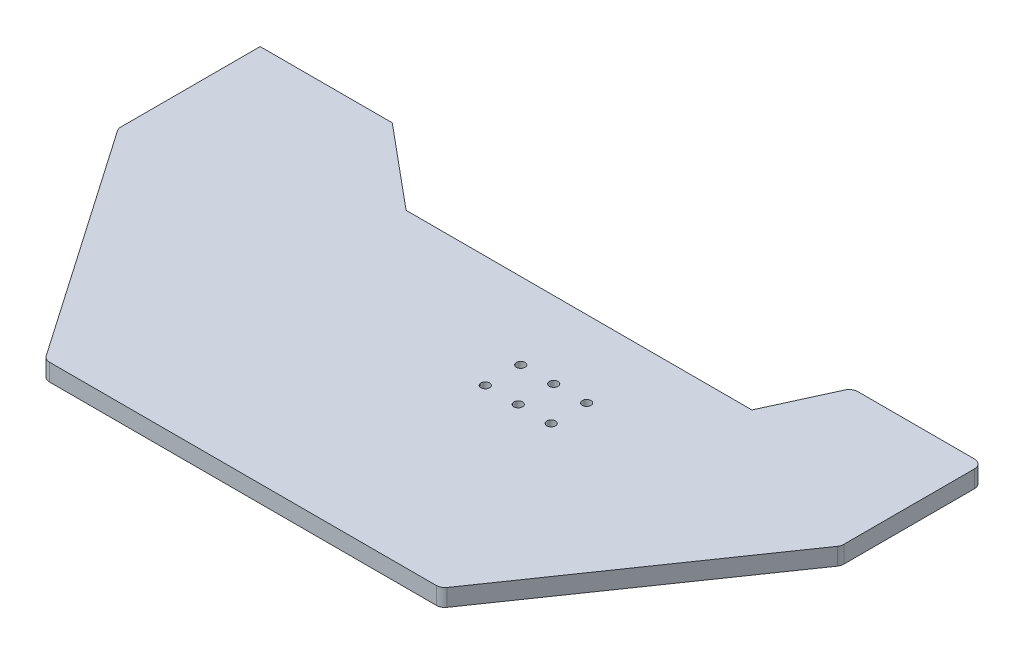
ISO-10303-21;
HEADER;
FILE_DESCRIPTION(('STEP AP214'),'2;1');
FILE_NAME('part.step','',(''),(''),'','','');
FILE_SCHEMA(('AUTOMOTIVE_DESIGN { 1 0 10303 214 1 1 1 1 }'));
ENDSEC;
DATA;
#1=APPLICATION_CONTEXT('core data for automotive mechanical design processes');
#2=APPLICATION_PROTOCOL_DEFINITION('international standard','automotive_design',2000,#1);
#3=PRODUCT_CONTEXT('',#1,'mechanical');
#4=PRODUCT('Part','Part','',(#3));
#5=PRODUCT_RELATED_PRODUCT_CATEGORY('part','',(#4));
#6=PRODUCT_DEFINITION_FORMATION('','',#4);
#7=PRODUCT_DEFINITION_CONTEXT('part definition',#1,'design');
#8=PRODUCT_DEFINITION('design','',#6,#7);
#9=PRODUCT_DEFINITION_SHAPE('','',#8);
#10=(LENGTH_UNIT() NAMED_UNIT(*) SI_UNIT(.MILLI.,.METRE.));
#11=(NAMED_UNIT(*) PLANE_ANGLE_UNIT() SI_UNIT($,.RADIAN.));
#12=(NAMED_UNIT(*) SI_UNIT($,.STERADIAN.) SOLID_ANGLE_UNIT());
#13=UNCERTAINTY_MEASURE_WITH_UNIT(LENGTH_MEASURE(1.E-05),#10,'distance_accuracy_value','');
#14=(GEOMETRIC_REPRESENTATION_CONTEXT(3) GLOBAL_UNCERTAINTY_ASSIGNED_CONTEXT((#13)) GLOBAL_UNIT_ASSIGNED_CONTEXT((#10,
#11,#12)) REPRESENTATION_CONTEXT('',''));
#15=CARTESIAN_POINT('',(0.,0.,0.));
#16=DIRECTION('',(0.,0.,1.));
#17=DIRECTION('',(1.,0.,0.));
#18=AXIS2_PLACEMENT_3D('',#15,#16,#17);
#19=CARTESIAN_POINT('',(-266.7,6.35,139.7));
#20=DIRECTION('',(0.,0.,-1.));
#21=DIRECTION('',(-1.,0.,0.));
#22=AXIS2_PLACEMENT_3D('',#19,#20,#21);
#23=PLANE('',#22);
#24=DIRECTION('',(1.,0.,0.));
#25=VECTOR('',#24,1.);
#26=CARTESIAN_POINT('',(-266.7,-6.35,139.7));
#27=LINE('',#26,#25);
#28=CARTESIAN_POINT('',(-142.719069440013,-6.35,139.7));
#29=VERTEX_POINT('',#28);
#30=CARTESIAN_POINT('',(142.719069440013,-6.35,139.7));
#31=VERTEX_POINT('',#30);
#32=EDGE_CURVE('E184',#29,#31,#27,.T.);
#33=ORIENTED_EDGE('',*,*,#32,.T.);
#34=DIRECTION('',(0.,1.,0.));
#35=VECTOR('',#34,1.);
#36=CARTESIAN_POINT('',(142.719069440013,6.35,139.7));
#37=LINE('',#36,#35);
#38=CARTESIAN_POINT('',(142.719069440013,6.35,139.7));
#39=VERTEX_POINT('',#38);
#40=EDGE_CURVE('E246',#31,#39,#37,.T.);
#41=ORIENTED_EDGE('',*,*,#40,.T.);
#42=DIRECTION('',(1.,0.,0.));
#43=VECTOR('',#42,1.);
#44=CARTESIAN_POINT('',(-266.7,6.35,139.7));
#45=LINE('',#44,#43);
#46=CARTESIAN_POINT('',(-142.719069440013,6.35,139.7));
#47=VERTEX_POINT('',#46);
#48=EDGE_CURVE('E306',#47,#39,#45,.T.);
#49=ORIENTED_EDGE('',*,*,#48,.F.);
#50=DIRECTION('',(0.,1.,0.));
#51=VECTOR('',#50,1.);
#52=CARTESIAN_POINT('',(-142.719069440013,6.35,139.7));
#53=LINE('',#52,#51);
#54=EDGE_CURVE('E244',#47,#29,#53,.F.);
#55=ORIENTED_EDGE('',*,*,#54,.T.);
#56=EDGE_LOOP('',(#33,#41,#49,#55));
#57=FACE_BOUND('',#56,.T.);
#58=ADVANCED_FACE('F33',(#57),#23,.F.);
#59=CARTESIAN_POINT('',(266.7,6.35,-139.7));
#60=DIRECTION('',(-1.,0.,0.));
#61=DIRECTION('',(0.,0.,1.));
#62=AXIS2_PLACEMENT_3D('',#59,#60,#61);
#63=PLANE('',#62);
#64=DIRECTION('',(0.,0.,-1.));
#65=VECTOR('',#64,1.);
#66=CARTESIAN_POINT('',(266.7,-6.35,-139.7));
#67=LINE('',#66,#65);
#68=CARTESIAN_POINT('',(266.7,-6.35,-36.9052942315606));
#69=VERTEX_POINT('',#68);
#70=CARTESIAN_POINT('',(266.7,-6.35,-133.35));
#71=VERTEX_POINT('',#70);
#72=EDGE_CURVE('E188',#69,#71,#67,.T.);
#73=ORIENTED_EDGE('',*,*,#72,.T.);
#74=DIRECTION('',(0.,-1.,0.));
#75=VECTOR('',#74,1.);
#76=CARTESIAN_POINT('',(266.7,6.35,-133.35));
#77=LINE('',#76,#75);
#78=CARTESIAN_POINT('',(266.7,6.35,-133.35));
#79=VERTEX_POINT('',#78);
#80=EDGE_CURVE('E237',#71,#79,#77,.F.);
#81=ORIENTED_EDGE('',*,*,#80,.T.);
#82=DIRECTION('',(0.,0.,-1.));
#83=VECTOR('',#82,1.);
#84=CARTESIAN_POINT('',(266.7,6.35,-139.7));
#85=LINE('',#84,#83);
#86=CARTESIAN_POINT('',(266.7,6.35,-36.9052942315606));
#87=VERTEX_POINT('',#86);
#88=EDGE_CURVE('E308',#87,#79,#85,.T.);
#89=ORIENTED_EDGE('',*,*,#88,.F.);
#90=DIRECTION('',(0.,1.,0.));
#91=VECTOR('',#90,1.);
#92=CARTESIAN_POINT('',(266.7,-6.35,-36.9052942315605));
#93=LINE('',#92,#91);
#94=EDGE_CURVE('E235',#87,#69,#93,.F.);
#95=ORIENTED_EDGE('',*,*,#94,.T.);
#96=EDGE_LOOP('',(#73,#81,#89,#95));
#97=FACE_BOUND('',#96,.T.);
#98=ADVANCED_FACE('F355',(#97),#63,.F.);
#99=CARTESIAN_POINT('',(0.,6.35,0.));
#100=DIRECTION('',(0.,-1.,0.));
#101=DIRECTION('',(0.,0.,-1.));
#102=AXIS2_PLACEMENT_3D('',#99,#100,#101);
#103=PLANE('',#102);
#104=CARTESIAN_POINT('',(81.4832,6.35,-6.24839999999997));
#105=DIRECTION('',(0.,1.,0.));
#106=DIRECTION('',(0.,0.,1.));
#107=AXIS2_PLACEMENT_3D('',#104,#105,#106);
#108=CIRCLE('',#107,3.175);
#109=CARTESIAN_POINT('',(81.4832,6.35,-3.07339999999998));
#110=VERTEX_POINT('',#109);
#111=EDGE_CURVE('E292',#110,#110,#108,.T.);
#112=ORIENTED_EDGE('',*,*,#111,.F.);
#113=EDGE_LOOP('',(#112));
#114=FACE_BOUND('',#113,.T.);
#115=CARTESIAN_POINT('',(81.4832,6.35,-32.4104));
#116=DIRECTION('',(0.,1.,0.));
#117=DIRECTION('',(0.,0.,1.));
#118=AXIS2_PLACEMENT_3D('',#115,#116,#117);
#119=CIRCLE('',#118,3.175);
#120=CARTESIAN_POINT('',(81.4832,6.35,-29.2354));
#121=VERTEX_POINT('',#120);
#122=EDGE_CURVE('E293',#121,#121,#119,.T.);
#123=ORIENTED_EDGE('',*,*,#122,.F.);
#124=EDGE_LOOP('',(#123));
#125=FACE_BOUND('',#124,.T.);
#126=CARTESIAN_POINT('',(57.1627,6.35,-32.4104));
#127=DIRECTION('',(0.,1.,0.));
#128=DIRECTION('',(0.,0.,1.));
#129=AXIS2_PLACEMENT_3D('',#126,#127,#128);
#130=CIRCLE('',#129,3.175);
#131=CARTESIAN_POINT('',(57.1627,6.35,-29.2354));
#132=VERTEX_POINT('',#131);
#133=EDGE_CURVE('E274',#132,#132,#130,.T.);
#134=ORIENTED_EDGE('',*,*,#133,.F.);
#135=EDGE_LOOP('',(#134));
#136=FACE_BOUND('',#135,.T.);
#137=CARTESIAN_POINT('',(32.8422,6.35,-32.4104));
#138=DIRECTION('',(0.,1.,0.));
#139=DIRECTION('',(0.,0.,1.));
#140=AXIS2_PLACEMENT_3D('',#137,#138,#139);
#141=CIRCLE('',#140,3.175);
#142=CARTESIAN_POINT('',(32.8422,6.35,-29.2354));
#143=VERTEX_POINT('',#142);
#144=EDGE_CURVE('E275',#143,#143,#141,.T.);
#145=ORIENTED_EDGE('',*,*,#144,.F.);
#146=EDGE_LOOP('',(#145));
#147=FACE_BOUND('',#146,.T.);
#148=CARTESIAN_POINT('',(32.8422,6.35,-6.24839999999997));
#149=DIRECTION('',(0.,1.,0.));
#150=DIRECTION('',(0.,0.,1.));
#151=AXIS2_PLACEMENT_3D('',#148,#149,#150);
#152=CIRCLE('',#151,3.175);
#153=CARTESIAN_POINT('',(32.8422,6.35,-3.07339999999998));
#154=VERTEX_POINT('',#153);
#155=EDGE_CURVE('E281',#154,#154,#152,.T.);
#156=ORIENTED_EDGE('',*,*,#155,.F.);
#157=EDGE_LOOP('',(#156));
#158=FACE_BOUND('',#157,.T.);
#159=CARTESIAN_POINT('',(57.1627,6.35,-6.24839999999998));
#160=DIRECTION('',(0.,1.,0.));
#161=DIRECTION('',(0.,0.,1.));
#162=AXIS2_PLACEMENT_3D('',#159,#160,#161);
#163=CIRCLE('',#162,3.175);
#164=CARTESIAN_POINT('',(57.1627,6.35,-3.07339999999998));
#165=VERTEX_POINT('',#164);
#166=EDGE_CURVE('E264',#165,#165,#163,.T.);
#167=ORIENTED_EDGE('',*,*,#166,.F.);
#168=EDGE_LOOP('',(#167));
#169=FACE_BOUND('',#168,.T.);
#170=DIRECTION('',(-1.,0.,0.));
#171=VECTOR('',#170,1.);
#172=CARTESIAN_POINT('',(170.18,6.35,-139.7));
#173=LINE('',#172,#171);
#174=CARTESIAN_POINT('',(260.35,6.35,-139.7));
#175=VERTEX_POINT('',#174);
#176=CARTESIAN_POINT('',(174.257872298125,6.35,-139.7));
#177=VERTEX_POINT('',#176);
#178=EDGE_CURVE('E158',#175,#177,#173,.T.);
#179=ORIENTED_EDGE('',*,*,#178,.T.);
#180=CARTESIAN_POINT('',(174.257872298125,6.35,-133.35));
#181=DIRECTION('',(0.,-1.,0.));
#182=DIRECTION('',(0.,0.,-1.));
#183=AXIS2_PLACEMENT_3D('',#180,#181,#182);
#184=CIRCLE('',#183,6.35);
#185=CARTESIAN_POINT('',(168.483489425197,6.35,-135.991780164365));
#186=VERTEX_POINT('',#185);
#187=EDGE_CURVE('E154',#177,#186,#184,.F.);
#188=ORIENTED_EDGE('',*,*,#187,.T.);
#189=DIRECTION('',(-0.416028372340905,0.,0.909351633532033));
#190=VECTOR('',#189,1.);
#191=CARTESIAN_POINT('',(146.939,6.35,-88.9));
#192=LINE('',#191,#190);
#193=CARTESIAN_POINT('',(146.939,6.35,-88.9));
#194=VERTEX_POINT('',#193);
#195=EDGE_CURVE('E146',#186,#194,#192,.T.);
#196=ORIENTED_EDGE('',*,*,#195,.T.);
#197=DIRECTION('',(-1.,0.,0.));
#198=VECTOR('',#197,1.);
#199=CARTESIAN_POINT('',(-108.237741638452,6.35,-88.9));
#200=LINE('',#199,#198);
#201=CARTESIAN_POINT('',(-108.237741638452,6.35,-88.9));
#202=VERTEX_POINT('',#201);
#203=EDGE_CURVE('E151',#194,#202,#200,.T.);
#204=ORIENTED_EDGE('',*,*,#203,.T.);
#205=DIRECTION('',(-0.768374908491942,0.,-0.64));
#206=VECTOR('',#205,1.);
#207=CARTESIAN_POINT('',(-169.2275,6.35,-139.7));
#208=LINE('',#207,#206);
#209=CARTESIAN_POINT('',(-169.2275,6.35,-139.7));
#210=VERTEX_POINT('',#209);
#211=EDGE_CURVE('E173',#202,#210,#208,.T.);
#212=ORIENTED_EDGE('',*,*,#211,.T.);
#213=DIRECTION('',(-1.,0.,0.));
#214=VECTOR('',#213,1.);
#215=CARTESIAN_POINT('',(-266.7,6.35,-139.7));
#216=LINE('',#215,#214);
#217=CARTESIAN_POINT('',(-266.7,6.35,-139.7));
#218=VERTEX_POINT('',#217);
#219=EDGE_CURVE('E175',#210,#218,#216,.T.);
#220=ORIENTED_EDGE('',*,*,#219,.T.);
#221=DIRECTION('',(0.,0.,1.));
#222=VECTOR('',#221,1.);
#223=CARTESIAN_POINT('',(-266.7,6.35,139.7));
#224=LINE('',#223,#222);
#225=CARTESIAN_POINT('',(-266.7,6.35,-36.9052942315606));
#226=VERTEX_POINT('',#225);
#227=EDGE_CURVE('E201',#218,#226,#224,.T.);
#228=ORIENTED_EDGE('',*,*,#227,.T.);
#229=CARTESIAN_POINT('',(-260.35,6.35,-36.9052942315606));
#230=DIRECTION('',(0.,-1.,0.));
#231=DIRECTION('',(0.,0.,-1.));
#232=AXIS2_PLACEMENT_3D('',#229,#230,#231);
#233=CIRCLE('',#232,6.35);
#234=CARTESIAN_POINT('',(-265.574337646892,6.35,-33.2957518573441));
#235=VERTEX_POINT('',#234);
#236=EDGE_CURVE('E226',#226,#235,#233,.F.);
#237=ORIENTED_EDGE('',*,*,#236,.T.);
#238=DIRECTION('',(-0.568431869955349,0.,-0.822730338093269));
#239=VECTOR('',#238,1.);
#240=CARTESIAN_POINT('',(-266.7,6.35,-34.925));
#241=LINE('',#240,#239);
#242=CARTESIAN_POINT('',(-147.943407086905,6.35,136.959542374217));
#243=VERTEX_POINT('',#242);
#244=EDGE_CURVE('E255',#243,#235,#241,.T.);
#245=ORIENTED_EDGE('',*,*,#244,.F.);
#246=CARTESIAN_POINT('',(-142.719069440013,6.35,133.35));
#247=DIRECTION('',(0.,-1.,0.));
#248=DIRECTION('',(0.,0.,-1.));
#249=AXIS2_PLACEMENT_3D('',#246,#247,#248);
#250=CIRCLE('',#249,6.35);
#251=EDGE_CURVE('E56',#243,#47,#250,.F.);
#252=ORIENTED_EDGE('',*,*,#251,.T.);
#253=ORIENTED_EDGE('',*,*,#48,.T.);
#254=CARTESIAN_POINT('',(142.719069440013,6.35,133.35));
#255=DIRECTION('',(0.,-1.,0.));
#256=DIRECTION('',(0.,0.,-1.));
#257=AXIS2_PLACEMENT_3D('',#254,#255,#256);
#258=CIRCLE('',#257,6.35);
#259=CARTESIAN_POINT('',(147.943407086905,6.35,136.959542374217));
#260=VERTEX_POINT('',#259);
#261=EDGE_CURVE('E48',#39,#260,#258,.F.);
#262=ORIENTED_EDGE('',*,*,#261,.T.);
#263=DIRECTION('',(0.568431869955349,0.,-0.822730338093269));
#264=VECTOR('',#263,1.);
#265=CARTESIAN_POINT('',(266.7,6.35,-34.925));
#266=LINE('',#265,#264);
#267=CARTESIAN_POINT('',(265.574337646892,6.35,-33.2957518573441));
#268=VERTEX_POINT('',#267);
#269=EDGE_CURVE('E267',#260,#268,#266,.T.);
#270=ORIENTED_EDGE('',*,*,#269,.T.);
#271=CARTESIAN_POINT('',(260.35,6.35,-36.9052942315605));
#272=DIRECTION('',(0.,-1.,0.));
#273=DIRECTION('',(0.,0.,-1.));
#274=AXIS2_PLACEMENT_3D('',#271,#272,#273);
#275=CIRCLE('',#274,6.35);
#276=EDGE_CURVE('E230',#268,#87,#275,.F.);
#277=ORIENTED_EDGE('',*,*,#276,.T.);
#278=ORIENTED_EDGE('',*,*,#88,.T.);
#279=CARTESIAN_POINT('',(260.35,6.35,-133.35));
#280=DIRECTION('',(0.,-1.,0.));
#281=DIRECTION('',(0.,0.,-1.));
#282=AXIS2_PLACEMENT_3D('',#279,#280,#281);
#283=CIRCLE('',#282,6.35);
#284=EDGE_CURVE('E232',#79,#175,#283,.F.);
#285=ORIENTED_EDGE('',*,*,#284,.T.);
#286=EDGE_LOOP('',(#179,#188,#196,#204,#212,#220,#228,#237,#245,#252,#253,#262,#270,#277,#278,#285));
#287=FACE_BOUND('',#286,.T.);
#288=ADVANCED_FACE('F149',(#114,#125,#136,#147,#158,#169,#287),#103,.F.);
#289=CARTESIAN_POINT('',(0.,-6.35,0.));
#290=DIRECTION('',(0.,-1.,0.));
#291=DIRECTION('',(0.,0.,-1.));
#292=AXIS2_PLACEMENT_3D('',#289,#290,#291);
#293=PLANE('',#292);
#294=CARTESIAN_POINT('',(57.1627,-6.35,-6.24839999999998));
#295=DIRECTION('',(0.,1.,0.));
#296=DIRECTION('',(0.,0.,1.));
#297=AXIS2_PLACEMENT_3D('',#294,#295,#296);
#298=CIRCLE('',#297,3.175);
#299=CARTESIAN_POINT('',(57.1627,-6.35,-3.07339999999998));
#300=VERTEX_POINT('',#299);
#301=EDGE_CURVE('E284',#300,#300,#298,.T.);
#302=ORIENTED_EDGE('',*,*,#301,.T.);
#303=EDGE_LOOP('',(#302));
#304=FACE_BOUND('',#303,.T.);
#305=CARTESIAN_POINT('',(32.8422,-6.35,-6.24839999999997));
#306=DIRECTION('',(0.,1.,0.));
#307=DIRECTION('',(0.,0.,1.));
#308=AXIS2_PLACEMENT_3D('',#305,#306,#307);
#309=CIRCLE('',#308,3.175);
#310=CARTESIAN_POINT('',(32.8422,-6.35,-3.07339999999998));
#311=VERTEX_POINT('',#310);
#312=EDGE_CURVE('E278',#311,#311,#309,.T.);
#313=ORIENTED_EDGE('',*,*,#312,.T.);
#314=EDGE_LOOP('',(#313));
#315=FACE_BOUND('',#314,.T.);
#316=CARTESIAN_POINT('',(32.8422,-6.35,-32.4104));
#317=DIRECTION('',(0.,1.,0.));
#318=DIRECTION('',(0.,0.,1.));
#319=AXIS2_PLACEMENT_3D('',#316,#317,#318);
#320=CIRCLE('',#319,3.175);
#321=CARTESIAN_POINT('',(32.8422,-6.35,-29.2354));
#322=VERTEX_POINT('',#321);
#323=EDGE_CURVE('E271',#322,#322,#320,.T.);
#324=ORIENTED_EDGE('',*,*,#323,.T.);
#325=EDGE_LOOP('',(#324));
#326=FACE_BOUND('',#325,.T.);
#327=CARTESIAN_POINT('',(57.1627,-6.35,-32.4104));
#328=DIRECTION('',(0.,1.,0.));
#329=DIRECTION('',(0.,0.,1.));
#330=AXIS2_PLACEMENT_3D('',#327,#328,#329);
#331=CIRCLE('',#330,3.175);
#332=CARTESIAN_POINT('',(57.1627,-6.35,-29.2354));
#333=VERTEX_POINT('',#332);
#334=EDGE_CURVE('E296',#333,#333,#331,.T.);
#335=ORIENTED_EDGE('',*,*,#334,.T.);
#336=EDGE_LOOP('',(#335));
#337=FACE_BOUND('',#336,.T.);
#338=CARTESIAN_POINT('',(81.4832,-6.35,-32.4104));
#339=DIRECTION('',(0.,1.,0.));
#340=DIRECTION('',(0.,0.,1.));
#341=AXIS2_PLACEMENT_3D('',#338,#339,#340);
#342=CIRCLE('',#341,3.175);
#343=CARTESIAN_POINT('',(81.4832,-6.35,-29.2354));
#344=VERTEX_POINT('',#343);
#345=EDGE_CURVE('E289',#344,#344,#342,.T.);
#346=ORIENTED_EDGE('',*,*,#345,.T.);
#347=EDGE_LOOP('',(#346));
#348=FACE_BOUND('',#347,.T.);
#349=CARTESIAN_POINT('',(81.4832,-6.35,-6.24839999999997));
#350=DIRECTION('',(0.,1.,0.));
#351=DIRECTION('',(0.,0.,1.));
#352=AXIS2_PLACEMENT_3D('',#349,#350,#351);
#353=CIRCLE('',#352,3.175);
#354=CARTESIAN_POINT('',(81.4832,-6.35,-3.07339999999998));
#355=VERTEX_POINT('',#354);
#356=EDGE_CURVE('E185',#355,#355,#353,.T.);
#357=ORIENTED_EDGE('',*,*,#356,.T.);
#358=EDGE_LOOP('',(#357));
#359=FACE_BOUND('',#358,.T.);
#360=DIRECTION('',(-0.416028372340905,0.,0.909351633532033));
#361=VECTOR('',#360,1.);
#362=CARTESIAN_POINT('',(146.939,-6.35,-88.9));
#363=LINE('',#362,#361);
#364=CARTESIAN_POINT('',(168.483489425197,-6.35,-135.991780164365));
#365=VERTEX_POINT('',#364);
#366=CARTESIAN_POINT('',(146.939,-6.35,-88.9));
#367=VERTEX_POINT('',#366);
#368=EDGE_CURVE('E164',#365,#367,#363,.T.);
#369=ORIENTED_EDGE('',*,*,#368,.F.);
#370=CARTESIAN_POINT('',(174.257872298125,-6.35,-133.35));
#371=DIRECTION('',(0.,-1.,0.));
#372=DIRECTION('',(0.,0.,-1.));
#373=AXIS2_PLACEMENT_3D('',#370,#371,#372);
#374=CIRCLE('',#373,6.35);
#375=CARTESIAN_POINT('',(174.257872298125,-6.35,-139.7));
#376=VERTEX_POINT('',#375);
#377=EDGE_CURVE('E219',#365,#376,#374,.T.);
#378=ORIENTED_EDGE('',*,*,#377,.T.);
#379=DIRECTION('',(-1.,0.,0.));
#380=VECTOR('',#379,1.);
#381=CARTESIAN_POINT('',(170.18,-6.35,-139.7));
#382=LINE('',#381,#380);
#383=CARTESIAN_POINT('',(260.35,-6.35,-139.7));
#384=VERTEX_POINT('',#383);
#385=EDGE_CURVE('E191',#384,#376,#382,.T.);
#386=ORIENTED_EDGE('',*,*,#385,.F.);
#387=CARTESIAN_POINT('',(260.35,-6.35,-133.35));
#388=DIRECTION('',(0.,-1.,0.));
#389=DIRECTION('',(0.,0.,-1.));
#390=AXIS2_PLACEMENT_3D('',#387,#388,#389);
#391=CIRCLE('',#390,6.35);
#392=EDGE_CURVE('E217',#384,#71,#391,.T.);
#393=ORIENTED_EDGE('',*,*,#392,.T.);
#394=ORIENTED_EDGE('',*,*,#72,.F.);
#395=CARTESIAN_POINT('',(260.35,-6.35,-36.9052942315605));
#396=DIRECTION('',(0.,-1.,0.));
#397=DIRECTION('',(0.,0.,-1.));
#398=AXIS2_PLACEMENT_3D('',#395,#396,#397);
#399=CIRCLE('',#398,6.35);
#400=CARTESIAN_POINT('',(265.574337646892,-6.35,-33.2957518573441));
#401=VERTEX_POINT('',#400);
#402=EDGE_CURVE('E215',#69,#401,#399,.T.);
#403=ORIENTED_EDGE('',*,*,#402,.T.);
#404=DIRECTION('',(0.568431869955349,0.,-0.822730338093269));
#405=VECTOR('',#404,1.);
#406=CARTESIAN_POINT('',(266.7,-6.35,-34.925));
#407=LINE('',#406,#405);
#408=CARTESIAN_POINT('',(147.943407086905,-6.35,136.959542374217));
#409=VERTEX_POINT('',#408);
#410=EDGE_CURVE('E262',#409,#401,#407,.T.);
#411=ORIENTED_EDGE('',*,*,#410,.F.);
#412=CARTESIAN_POINT('',(142.719069440013,-6.35,133.35));
#413=DIRECTION('',(0.,-1.,0.));
#414=DIRECTION('',(0.,0.,-1.));
#415=AXIS2_PLACEMENT_3D('',#412,#413,#414);
#416=CIRCLE('',#415,6.35);
#417=EDGE_CURVE('E213',#409,#31,#416,.T.);
#418=ORIENTED_EDGE('',*,*,#417,.T.);
#419=ORIENTED_EDGE('',*,*,#32,.F.);
#420=CARTESIAN_POINT('',(-142.719069440013,-6.35,133.35));
#421=DIRECTION('',(0.,-1.,0.));
#422=DIRECTION('',(0.,0.,-1.));
#423=AXIS2_PLACEMENT_3D('',#420,#421,#422);
#424=CIRCLE('',#423,6.35);
#425=CARTESIAN_POINT('',(-147.943407086905,-6.35,136.959542374217));
#426=VERTEX_POINT('',#425);
#427=EDGE_CURVE('E211',#29,#426,#424,.T.);
#428=ORIENTED_EDGE('',*,*,#427,.T.);
#429=DIRECTION('',(-0.568431869955349,0.,-0.822730338093269));
#430=VECTOR('',#429,1.);
#431=CARTESIAN_POINT('',(-266.7,-6.35,-34.925));
#432=LINE('',#431,#430);
#433=CARTESIAN_POINT('',(-265.574337646892,-6.35,-33.2957518573441));
#434=VERTEX_POINT('',#433);
#435=EDGE_CURVE('E258',#426,#434,#432,.T.);
#436=ORIENTED_EDGE('',*,*,#435,.T.);
#437=CARTESIAN_POINT('',(-260.35,-6.35,-36.9052942315606));
#438=DIRECTION('',(0.,-1.,0.));
#439=DIRECTION('',(0.,0.,-1.));
#440=AXIS2_PLACEMENT_3D('',#437,#438,#439);
#441=CIRCLE('',#440,6.35);
#442=CARTESIAN_POINT('',(-266.7,-6.35,-36.9052942315606));
#443=VERTEX_POINT('',#442);
#444=EDGE_CURVE('E209',#434,#443,#441,.T.);
#445=ORIENTED_EDGE('',*,*,#444,.T.);
#446=DIRECTION('',(0.,0.,1.));
#447=VECTOR('',#446,1.);
#448=CARTESIAN_POINT('',(-266.7,-6.35,139.7));
#449=LINE('',#448,#447);
#450=CARTESIAN_POINT('',(-266.7,-6.35,-139.7));
#451=VERTEX_POINT('',#450);
#452=EDGE_CURVE('E181',#451,#443,#449,.T.);
#453=ORIENTED_EDGE('',*,*,#452,.F.);
#454=DIRECTION('',(-1.,0.,0.));
#455=VECTOR('',#454,1.);
#456=CARTESIAN_POINT('',(-266.7,-6.35,-139.7));
#457=LINE('',#456,#455);
#458=CARTESIAN_POINT('',(-169.2275,-6.35,-139.7));
#459=VERTEX_POINT('',#458);
#460=EDGE_CURVE('E199',#459,#451,#457,.T.);
#461=ORIENTED_EDGE('',*,*,#460,.F.);
#462=DIRECTION('',(-0.768374908491942,0.,-0.64));
#463=VECTOR('',#462,1.);
#464=CARTESIAN_POINT('',(-169.2275,-6.35,-139.7));
#465=LINE('',#464,#463);
#466=CARTESIAN_POINT('',(-108.237741638452,-6.35,-88.9));
#467=VERTEX_POINT('',#466);
#468=EDGE_CURVE('E197',#467,#459,#465,.T.);
#469=ORIENTED_EDGE('',*,*,#468,.F.);
#470=DIRECTION('',(-1.,0.,0.));
#471=VECTOR('',#470,1.);
#472=CARTESIAN_POINT('',(-108.237741638452,-6.35,-88.9));
#473=LINE('',#472,#471);
#474=EDGE_CURVE('E195',#367,#467,#473,.T.);
#475=ORIENTED_EDGE('',*,*,#474,.F.);
#476=EDGE_LOOP('',(#369,#378,#386,#393,#394,#403,#411,#418,#419,#428,#436,#445,#453,#461,#469,#475));
#477=FACE_BOUND('',#476,.T.);
#478=ADVANCED_FACE('F318',(#304,#315,#326,#337,#348,#359,#477),#293,.T.);
#479=CARTESIAN_POINT('',(-266.7,6.35,139.7));
#480=DIRECTION('',(1.,0.,0.));
#481=DIRECTION('',(0.,0.,-1.));
#482=AXIS2_PLACEMENT_3D('',#479,#480,#481);
#483=PLANE('',#482);
#484=ORIENTED_EDGE('',*,*,#452,.T.);
#485=DIRECTION('',(0.,1.,0.));
#486=VECTOR('',#485,1.);
#487=CARTESIAN_POINT('',(-266.7,6.35,-36.9052942315606));
#488=LINE('',#487,#486);
#489=EDGE_CURVE('E11',#443,#226,#488,.T.);
#490=ORIENTED_EDGE('',*,*,#489,.T.);
#491=ORIENTED_EDGE('',*,*,#227,.F.);
#492=DIRECTION('',(0.,-1.,0.));
#493=VECTOR('',#492,1.);
#494=CARTESIAN_POINT('',(-266.7,6.35,-139.7));
#495=LINE('',#494,#493);
#496=EDGE_CURVE('E180',#218,#451,#495,.T.);
#497=ORIENTED_EDGE('',*,*,#496,.T.);
#498=EDGE_LOOP('',(#484,#490,#491,#497));
#499=FACE_BOUND('',#498,.T.);
#500=ADVANCED_FACE('F332',(#499),#483,.F.);
#501=CARTESIAN_POINT('',(170.18,6.35,-139.7));
#502=DIRECTION('',(0.,0.,1.));
#503=DIRECTION('',(1.,0.,0.));
#504=AXIS2_PLACEMENT_3D('',#501,#502,#503);
#505=PLANE('',#504);
#506=ORIENTED_EDGE('',*,*,#385,.T.);
#507=DIRECTION('',(0.,-1.,0.));
#508=VECTOR('',#507,1.);
#509=CARTESIAN_POINT('',(174.257872298125,6.35,-139.7));
#510=LINE('',#509,#508);
#511=EDGE_CURVE('E224',#376,#177,#510,.F.);
#512=ORIENTED_EDGE('',*,*,#511,.T.);
#513=ORIENTED_EDGE('',*,*,#178,.F.);
#514=DIRECTION('',(0.,-1.,0.));
#515=VECTOR('',#514,1.);
#516=CARTESIAN_POINT('',(260.35,6.35,-139.7));
#517=LINE('',#516,#515);
#518=EDGE_CURVE('E221',#175,#384,#517,.T.);
#519=ORIENTED_EDGE('',*,*,#518,.T.);
#520=EDGE_LOOP('',(#506,#512,#513,#519));
#521=FACE_BOUND('',#520,.T.);
#522=ADVANCED_FACE('F359',(#521),#505,.F.);
#523=CARTESIAN_POINT('',(146.939,6.35,-88.9));
#524=DIRECTION('',(0.909351633532033,0.,0.416028372340905));
#525=DIRECTION('',(0.416028372340905,0.,-0.909351633532033));
#526=AXIS2_PLACEMENT_3D('',#523,#524,#525);
#527=PLANE('',#526);
#528=ORIENTED_EDGE('',*,*,#195,.F.);
#529=DIRECTION('',(0.,-1.,0.));
#530=VECTOR('',#529,1.);
#531=CARTESIAN_POINT('',(168.483489425197,6.35,-135.991780164365));
#532=LINE('',#531,#530);
#533=EDGE_CURVE('E167',#186,#365,#532,.T.);
#534=ORIENTED_EDGE('',*,*,#533,.T.);
#535=ORIENTED_EDGE('',*,*,#368,.T.);
#536=DIRECTION('',(0.,-1.,0.));
#537=VECTOR('',#536,1.);
#538=CARTESIAN_POINT('',(146.939,6.35,-88.9));
#539=LINE('',#538,#537);
#540=EDGE_CURVE('E161',#194,#367,#539,.T.);
#541=ORIENTED_EDGE('',*,*,#540,.F.);
#542=EDGE_LOOP('',(#528,#534,#535,#541));
#543=FACE_BOUND('',#542,.T.);
#544=ADVANCED_FACE('F162',(#543),#527,.F.);
#545=CARTESIAN_POINT('',(-108.237741638452,6.35,-88.9));
#546=DIRECTION('',(0.,0.,1.));
#547=DIRECTION('',(1.,0.,0.));
#548=AXIS2_PLACEMENT_3D('',#545,#546,#547);
#549=PLANE('',#548);
#550=ORIENTED_EDGE('',*,*,#474,.T.);
#551=DIRECTION('',(0.,-1.,0.));
#552=VECTOR('',#551,1.);
#553=CARTESIAN_POINT('',(-108.237741638452,6.35,-88.9));
#554=LINE('',#553,#552);
#555=EDGE_CURVE('E168',#202,#467,#554,.T.);
#556=ORIENTED_EDGE('',*,*,#555,.F.);
#557=ORIENTED_EDGE('',*,*,#203,.F.);
#558=ORIENTED_EDGE('',*,*,#540,.T.);
#559=EDGE_LOOP('',(#550,#556,#557,#558));
#560=FACE_BOUND('',#559,.T.);
#561=ADVANCED_FACE('F170',(#560),#549,.F.);
#562=CARTESIAN_POINT('',(-169.2275,6.35,-139.7));
#563=DIRECTION('',(-0.64,0.,0.768374908491942));
#564=DIRECTION('',(0.768374908491942,0.,0.64));
#565=AXIS2_PLACEMENT_3D('',#562,#563,#564);
#566=PLANE('',#565);
#567=ORIENTED_EDGE('',*,*,#468,.T.);
#568=DIRECTION('',(0.,-1.,0.));
#569=VECTOR('',#568,1.);
#570=CARTESIAN_POINT('',(-169.2275,6.35,-139.7));
#571=LINE('',#570,#569);
#572=EDGE_CURVE('E204',#210,#459,#571,.T.);
#573=ORIENTED_EDGE('',*,*,#572,.F.);
#574=ORIENTED_EDGE('',*,*,#211,.F.);
#575=ORIENTED_EDGE('',*,*,#555,.T.);
#576=EDGE_LOOP('',(#567,#573,#574,#575));
#577=FACE_BOUND('',#576,.T.);
#578=ADVANCED_FACE('F323',(#577),#566,.F.);
#579=CARTESIAN_POINT('',(-266.7,6.35,-139.7));
#580=DIRECTION('',(0.,0.,1.));
#581=DIRECTION('',(1.,0.,0.));
#582=AXIS2_PLACEMENT_3D('',#579,#580,#581);
#583=PLANE('',#582);
#584=ORIENTED_EDGE('',*,*,#460,.T.);
#585=ORIENTED_EDGE('',*,*,#496,.F.);
#586=ORIENTED_EDGE('',*,*,#219,.F.);
#587=ORIENTED_EDGE('',*,*,#572,.T.);
#588=EDGE_LOOP('',(#584,#585,#586,#587));
#589=FACE_BOUND('',#588,.T.);
#590=ADVANCED_FACE('F329',(#589),#583,.F.);
#591=CARTESIAN_POINT('',(81.4832,-6.35,-6.24839999999997));
#592=DIRECTION('',(0.,1.,0.));
#593=DIRECTION('',(0.,0.,1.));
#594=AXIS2_PLACEMENT_3D('',#591,#592,#593);
#595=CYLINDRICAL_SURFACE('',#594,3.175);
#596=ORIENTED_EDGE('',*,*,#356,.F.);
#597=EDGE_LOOP('',(#596));
#598=FACE_BOUND('',#597,.T.);
#599=ORIENTED_EDGE('',*,*,#111,.T.);
#600=EDGE_LOOP('',(#599));
#601=FACE_BOUND('',#600,.T.);
#602=ADVANCED_FACE('F528',(#598,#601),#595,.F.);
#603=CARTESIAN_POINT('',(81.4832,-6.35,-32.4104));
#604=DIRECTION('',(0.,1.,0.));
#605=DIRECTION('',(0.,0.,1.));
#606=AXIS2_PLACEMENT_3D('',#603,#604,#605);
#607=CYLINDRICAL_SURFACE('',#606,3.175);
#608=ORIENTED_EDGE('',*,*,#345,.F.);
#609=EDGE_LOOP('',(#608));
#610=FACE_BOUND('',#609,.T.);
#611=ORIENTED_EDGE('',*,*,#122,.T.);
#612=EDGE_LOOP('',(#611));
#613=FACE_BOUND('',#612,.T.);
#614=ADVANCED_FACE('F518',(#610,#613),#607,.F.);
#615=CARTESIAN_POINT('',(57.1627,-6.35,-32.4104));
#616=DIRECTION('',(0.,1.,0.));
#617=DIRECTION('',(0.,0.,1.));
#618=AXIS2_PLACEMENT_3D('',#615,#616,#617);
#619=CYLINDRICAL_SURFACE('',#618,3.175);
#620=ORIENTED_EDGE('',*,*,#334,.F.);
#621=EDGE_LOOP('',(#620));
#622=FACE_BOUND('',#621,.T.);
#623=ORIENTED_EDGE('',*,*,#133,.T.);
#624=EDGE_LOOP('',(#623));
#625=FACE_BOUND('',#624,.T.);
#626=ADVANCED_FACE('F508',(#622,#625),#619,.F.);
#627=CARTESIAN_POINT('',(32.8422,-6.35,-32.4104));
#628=DIRECTION('',(0.,1.,0.));
#629=DIRECTION('',(0.,0.,1.));
#630=AXIS2_PLACEMENT_3D('',#627,#628,#629);
#631=CYLINDRICAL_SURFACE('',#630,3.175);
#632=ORIENTED_EDGE('',*,*,#323,.F.);
#633=EDGE_LOOP('',(#632));
#634=FACE_BOUND('',#633,.T.);
#635=ORIENTED_EDGE('',*,*,#144,.T.);
#636=EDGE_LOOP('',(#635));
#637=FACE_BOUND('',#636,.T.);
#638=ADVANCED_FACE('F498',(#634,#637),#631,.F.);
#639=CARTESIAN_POINT('',(32.8422,-6.35,-6.24839999999997));
#640=DIRECTION('',(0.,1.,0.));
#641=DIRECTION('',(0.,0.,1.));
#642=AXIS2_PLACEMENT_3D('',#639,#640,#641);
#643=CYLINDRICAL_SURFACE('',#642,3.175);
#644=ORIENTED_EDGE('',*,*,#312,.F.);
#645=EDGE_LOOP('',(#644));
#646=FACE_BOUND('',#645,.T.);
#647=ORIENTED_EDGE('',*,*,#155,.T.);
#648=EDGE_LOOP('',(#647));
#649=FACE_BOUND('',#648,.T.);
#650=ADVANCED_FACE('F488',(#646,#649),#643,.F.);
#651=CARTESIAN_POINT('',(57.1627,-6.35,-6.24839999999998));
#652=DIRECTION('',(0.,1.,0.));
#653=DIRECTION('',(0.,0.,1.));
#654=AXIS2_PLACEMENT_3D('',#651,#652,#653);
#655=CYLINDRICAL_SURFACE('',#654,3.175);
#656=ORIENTED_EDGE('',*,*,#301,.F.);
#657=EDGE_LOOP('',(#656));
#658=FACE_BOUND('',#657,.T.);
#659=ORIENTED_EDGE('',*,*,#166,.T.);
#660=EDGE_LOOP('',(#659));
#661=FACE_BOUND('',#660,.T.);
#662=ADVANCED_FACE('F434',(#658,#661),#655,.F.);
#663=CARTESIAN_POINT('',(-266.7,-6.35,-34.925));
#664=DIRECTION('',(0.822730338093269,0.,-0.568431869955349));
#665=DIRECTION('',(-0.568431869955349,0.,-0.822730338093269));
#666=AXIS2_PLACEMENT_3D('',#663,#664,#665);
#667=PLANE('',#666);
#668=ORIENTED_EDGE('',*,*,#435,.F.);
#669=DIRECTION('',(0.,1.,0.));
#670=VECTOR('',#669,1.);
#671=CARTESIAN_POINT('',(-147.943407086905,-6.35,136.959542374216));
#672=LINE('',#671,#670);
#673=EDGE_CURVE('E41',#426,#243,#672,.T.);
#674=ORIENTED_EDGE('',*,*,#673,.T.);
#675=ORIENTED_EDGE('',*,*,#244,.T.);
#676=DIRECTION('',(0.,1.,0.));
#677=VECTOR('',#676,1.);
#678=CARTESIAN_POINT('',(-265.574337646892,-6.35,-33.2957518573441));
#679=LINE('',#678,#677);
#680=EDGE_CURVE('E248',#235,#434,#679,.F.);
#681=ORIENTED_EDGE('',*,*,#680,.T.);
#682=EDGE_LOOP('',(#668,#674,#675,#681));
#683=FACE_BOUND('',#682,.T.);
#684=ADVANCED_FACE('F254',(#683),#667,.F.);
#685=CARTESIAN_POINT('',(266.7,-6.35,-34.925));
#686=DIRECTION('',(0.822730338093269,0.,0.568431869955349));
#687=DIRECTION('',(0.568431869955349,0.,-0.822730338093269));
#688=AXIS2_PLACEMENT_3D('',#685,#686,#687);
#689=PLANE('',#688);
#690=ORIENTED_EDGE('',*,*,#410,.T.);
#691=DIRECTION('',(0.,1.,0.));
#692=VECTOR('',#691,1.);
#693=CARTESIAN_POINT('',(265.574337646892,6.35,-33.2957518573441));
#694=LINE('',#693,#692);
#695=EDGE_CURVE('E241',#401,#268,#694,.T.);
#696=ORIENTED_EDGE('',*,*,#695,.T.);
#697=ORIENTED_EDGE('',*,*,#269,.F.);
#698=DIRECTION('',(0.,1.,0.));
#699=VECTOR('',#698,1.);
#700=CARTESIAN_POINT('',(147.943407086905,-6.35,136.959542374216));
#701=LINE('',#700,#699);
#702=EDGE_CURVE('E239',#260,#409,#701,.F.);
#703=ORIENTED_EDGE('',*,*,#702,.T.);
#704=EDGE_LOOP('',(#690,#696,#697,#703));
#705=FACE_BOUND('',#704,.T.);
#706=ADVANCED_FACE('F343',(#705),#689,.T.);
#707=CARTESIAN_POINT('',(174.257872298125,6.35,-133.35));
#708=DIRECTION('',(0.,-1.,0.));
#709=DIRECTION('',(0.,0.,-1.));
#710=AXIS2_PLACEMENT_3D('',#707,#708,#709);
#711=CYLINDRICAL_SURFACE('',#710,6.35);
#712=ORIENTED_EDGE('',*,*,#187,.F.);
#713=ORIENTED_EDGE('',*,*,#511,.F.);
#714=ORIENTED_EDGE('',*,*,#377,.F.);
#715=ORIENTED_EDGE('',*,*,#533,.F.);
#716=EDGE_LOOP('',(#712,#713,#714,#715));
#717=FACE_BOUND('',#716,.T.);
#718=ADVANCED_FACE('F316',(#717),#711,.T.);
#719=CARTESIAN_POINT('',(260.35,6.35,-133.35));
#720=DIRECTION('',(0.,-1.,0.));
#721=DIRECTION('',(0.,0.,-1.));
#722=AXIS2_PLACEMENT_3D('',#719,#720,#721);
#723=CYLINDRICAL_SURFACE('',#722,6.35);
#724=ORIENTED_EDGE('',*,*,#284,.F.);
#725=ORIENTED_EDGE('',*,*,#80,.F.);
#726=ORIENTED_EDGE('',*,*,#392,.F.);
#727=ORIENTED_EDGE('',*,*,#518,.F.);
#728=EDGE_LOOP('',(#724,#725,#726,#727));
#729=FACE_BOUND('',#728,.T.);
#730=ADVANCED_FACE('F358',(#729),#723,.T.);
#731=CARTESIAN_POINT('',(260.35,-6.35,-36.9052942315605));
#732=DIRECTION('',(0.,-1.,0.));
#733=DIRECTION('',(0.,0.,-1.));
#734=AXIS2_PLACEMENT_3D('',#731,#732,#733);
#735=CYLINDRICAL_SURFACE('',#734,6.35);
#736=ORIENTED_EDGE('',*,*,#402,.F.);
#737=ORIENTED_EDGE('',*,*,#94,.F.);
#738=ORIENTED_EDGE('',*,*,#276,.F.);
#739=ORIENTED_EDGE('',*,*,#695,.F.);
#740=EDGE_LOOP('',(#736,#737,#738,#739));
#741=FACE_BOUND('',#740,.T.);
#742=ADVANCED_FACE('F351',(#741),#735,.T.);
#743=CARTESIAN_POINT('',(142.719069440013,6.35,133.35));
#744=DIRECTION('',(0.,-1.,0.));
#745=DIRECTION('',(0.,0.,-1.));
#746=AXIS2_PLACEMENT_3D('',#743,#744,#745);
#747=CYLINDRICAL_SURFACE('',#746,6.35);
#748=ORIENTED_EDGE('',*,*,#417,.F.);
#749=ORIENTED_EDGE('',*,*,#702,.F.);
#750=ORIENTED_EDGE('',*,*,#261,.F.);
#751=ORIENTED_EDGE('',*,*,#40,.F.);
#752=EDGE_LOOP('',(#748,#749,#750,#751));
#753=FACE_BOUND('',#752,.T.);
#754=ADVANCED_FACE('F347',(#753),#747,.T.);
#755=CARTESIAN_POINT('',(-142.719069440013,-6.35,133.35));
#756=DIRECTION('',(0.,1.,0.));
#757=DIRECTION('',(0.,0.,1.));
#758=AXIS2_PLACEMENT_3D('',#755,#756,#757);
#759=CYLINDRICAL_SURFACE('',#758,6.35);
#760=ORIENTED_EDGE('',*,*,#427,.F.);
#761=ORIENTED_EDGE('',*,*,#54,.F.);
#762=ORIENTED_EDGE('',*,*,#251,.F.);
#763=ORIENTED_EDGE('',*,*,#673,.F.);
#764=EDGE_LOOP('',(#760,#761,#762,#763));
#765=FACE_BOUND('',#764,.T.);
#766=ADVANCED_FACE('F338',(#765),#759,.T.);
#767=CARTESIAN_POINT('',(-260.35,6.35,-36.9052942315606));
#768=DIRECTION('',(0.,1.,0.));
#769=DIRECTION('',(0.,0.,1.));
#770=AXIS2_PLACEMENT_3D('',#767,#768,#769);
#771=CYLINDRICAL_SURFACE('',#770,6.35);
#772=ORIENTED_EDGE('',*,*,#444,.F.);
#773=ORIENTED_EDGE('',*,*,#680,.F.);
#774=ORIENTED_EDGE('',*,*,#236,.F.);
#775=ORIENTED_EDGE('',*,*,#489,.F.);
#776=EDGE_LOOP('',(#772,#773,#774,#775));
#777=FACE_BOUND('',#776,.T.);
#778=ADVANCED_FACE('F35',(#777),#771,.T.);
#779=CLOSED_SHELL('',(#58,#98,#288,#478,#500,#522,#544,#561,#578,#590,#602,#614,#626,#638,#650,
#662,#684,#706,#718,#730,#742,#754,#766,#778));
#780=MANIFOLD_SOLID_BREP('B2',#779);
#781=ADVANCED_BREP_SHAPE_REPRESENTATION('',(#18,#780),#14);
#782=SHAPE_DEFINITION_REPRESENTATION(#9,#781);
ENDSEC;
END-ISO-10303-21;
